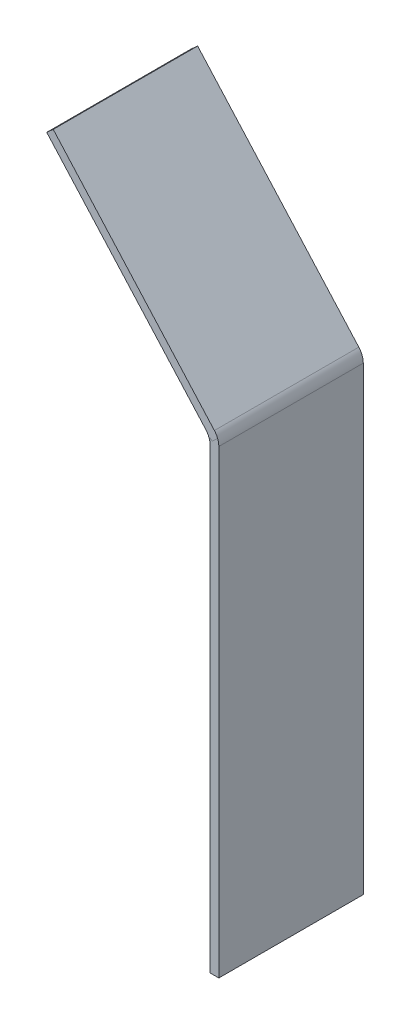
ISO-10303-21;
HEADER;
FILE_DESCRIPTION(('STEP AP214'),'2;1');
FILE_NAME('part.step','',(''),(''),'','','');
FILE_SCHEMA(('AUTOMOTIVE_DESIGN { 1 0 10303 214 1 1 1 1 }'));
ENDSEC;
DATA;
#1=APPLICATION_CONTEXT('core data for automotive mechanical design processes');
#2=APPLICATION_PROTOCOL_DEFINITION('international standard','automotive_design',2000,#1);
#3=PRODUCT_CONTEXT('',#1,'mechanical');
#4=PRODUCT('Part','Part','',(#3));
#5=PRODUCT_RELATED_PRODUCT_CATEGORY('part','',(#4));
#6=PRODUCT_DEFINITION_FORMATION('','',#4);
#7=PRODUCT_DEFINITION_CONTEXT('part definition',#1,'design');
#8=PRODUCT_DEFINITION('design','',#6,#7);
#9=PRODUCT_DEFINITION_SHAPE('','',#8);
#10=(LENGTH_UNIT() NAMED_UNIT(*) SI_UNIT(.MILLI.,.METRE.));
#11=(NAMED_UNIT(*) PLANE_ANGLE_UNIT() SI_UNIT($,.RADIAN.));
#12=(NAMED_UNIT(*) SI_UNIT($,.STERADIAN.) SOLID_ANGLE_UNIT());
#13=UNCERTAINTY_MEASURE_WITH_UNIT(LENGTH_MEASURE(1.E-05),#10,'distance_accuracy_value','');
#14=(GEOMETRIC_REPRESENTATION_CONTEXT(3) GLOBAL_UNCERTAINTY_ASSIGNED_CONTEXT((#13)) GLOBAL_UNIT_ASSIGNED_CONTEXT((#10,
#11,#12)) REPRESENTATION_CONTEXT('',''));
#15=CARTESIAN_POINT('',(0.,0.,0.));
#16=DIRECTION('',(0.,0.,1.));
#17=DIRECTION('',(1.,0.,0.));
#18=AXIS2_PLACEMENT_3D('',#15,#16,#17);
#19=CARTESIAN_POINT('',(-2.5,62.6737873182417,0.00137776001932606));
#20=DIRECTION('',(0.,2.19830343425287E-05,-0.999999999758373));
#21=DIRECTION('',(0.,0.999999999758373,2.19830343425287E-05));
#22=AXIS2_PLACEMENT_3D('',#19,#20,#21);
#23=CYLINDRICAL_SURFACE('',#22,2.);
#24=DIRECTION('',(0.,-2.19830343425287E-05,0.999999999758373));
#25=VECTOR('',#24,1.);
#26=CARTESIAN_POINT('',(-1.00928801516023,64.0071206514319,0.0014070707317867));
#27=LINE('',#26,#25);
#28=CARTESIAN_POINT('',(-1.00928801516023,64.0073038017603,-8.33003278047712));
#29=VERTEX_POINT('',#28);
#30=CARTESIAN_POINT('',(-1.00928801516023,64.0069396769131,8.23387015339831));
#31=VERTEX_POINT('',#30);
#32=EDGE_CURVE('E133',#29,#31,#27,.T.);
#33=ORIENTED_EDGE('',*,*,#32,.F.);
#34=CARTESIAN_POINT('',(-2.5,62.6739704685701,-8.33006209118958));
#35=DIRECTION('',(1.09234575886277E-05,9.77023748700299E-06,-0.99999999989261));
#36=DIRECTION('',(-0.666666666675069,0.745355992492415,0.));
#37=AXIS2_PLACEMENT_3D('',#34,#35,#36);
#38=ELLIPSE('',#37,2.00000000026847,2.);
#39=CARTESIAN_POINT('',(-0.5,62.6739704680899,-8.3300402442744));
#40=VERTEX_POINT('',#39);
#41=EDGE_CURVE('E46',#29,#40,#38,.T.);
#42=ORIENTED_EDGE('',*,*,#41,.T.);
#43=DIRECTION('',(0.,-2.19830343425287E-05,0.999999999758373));
#44=VECTOR('',#43,1.);
#45=CARTESIAN_POINT('',(-0.5,62.6737873182417,0.00137776001932606));
#46=LINE('',#45,#44);
#47=CARTESIAN_POINT('',(-0.5,62.673606343203,8.23386594537373));
#48=VERTEX_POINT('',#47);
#49=EDGE_CURVE('E277',#48,#40,#46,.F.);
#50=ORIENTED_EDGE('',*,*,#49,.F.);
#51=CARTESIAN_POINT('',(-2.5,62.673606343723,8.23384084268585));
#52=DIRECTION('',(-1.09234575886277E-05,-9.77023748700298E-06,0.99999999989261));
#53=DIRECTION('',(-0.666666666675069,0.745355992492414,0.));
#54=AXIS2_PLACEMENT_3D('',#51,#52,#53);
#55=ELLIPSE('',#54,2.00000000026847,2.);
#56=EDGE_CURVE('E11',#48,#31,#55,.T.);
#57=ORIENTED_EDGE('',*,*,#56,.T.);
#58=EDGE_LOOP('',(#33,#42,#50,#57));
#59=FACE_BOUND('',#58,.T.);
#60=ADVANCED_FACE('F39',(#59),#23,.F.);
#61=CARTESIAN_POINT('',(-1.5,63.0557533294683,0.00138615679127075));
#62=DIRECTION('',(0.,2.19830343425287E-05,-0.999999999758373));
#63=DIRECTION('',(0.,0.999999999758373,2.19830343425287E-05));
#64=AXIS2_PLACEMENT_3D('',#61,#62,#63);
#65=CYLINDRICAL_SURFACE('',#64,2.);
#66=DIRECTION('',(0.,2.19830343425287E-05,-0.999999999758373));
#67=VECTOR('',#66,1.);
#68=CARTESIAN_POINT('',(-0.00928801516023731,64.3890866626585,0.00141546750373138));
#69=LINE('',#68,#67);
#70=CARTESIAN_POINT('',(-0.00928801516024565,64.3889056880022,8.23388480875454));
#71=VERTEX_POINT('',#70);
#72=CARTESIAN_POINT('',(-0.00928801516022993,64.3892698128493,-8.33001812512089));
#73=VERTEX_POINT('',#72);
#74=EDGE_CURVE('E197',#71,#73,#69,.T.);
#75=ORIENTED_EDGE('',*,*,#74,.F.);
#76=CARTESIAN_POINT('',(-1.5,63.055572354812,8.23385549804208));
#77=DIRECTION('',(-1.09234575886277E-05,-9.77023748700298E-06,0.99999999989261));
#78=DIRECTION('',(-0.666666666675069,0.745355992492414,0.));
#79=AXIS2_PLACEMENT_3D('',#76,#77,#78);
#80=ELLIPSE('',#79,2.00000000026847,2.);
#81=CARTESIAN_POINT('',(0.364249124789158,63.7798479930207,8.23388293843332));
#82=VERTEX_POINT('',#81);
#83=EDGE_CURVE('E233',#82,#71,#80,.T.);
#84=ORIENTED_EDGE('',*,*,#83,.F.);
#85=CARTESIAN_POINT('',(0.364249124896864,63.779847993117,8.23386594537373));
#86=CARTESIAN_POINT('',(0.364244899312326,63.7798442136393,8.9005326120163));
#87=CARTESIAN_POINT('',(0.364240673727787,63.7798404341616,9.56719927865886));
#88=CARTESIAN_POINT('',(0.36423222255871,63.7798328752062,10.900532611944));
#89=CARTESIAN_POINT('',(0.364227996974171,63.7798290957285,11.5671992785865));
#90=CARTESIAN_POINT('',(0.364223771389633,63.7798253162507,12.2338659452291));
#91=B_SPLINE_CURVE_WITH_KNOTS('',3,(#85,#86,#87,#88,#89,#90),.UNSPECIFIED.,.F.,.F.,(4,2,4),(0.,
2.,4.),.UNSPECIFIED.);
#92=CARTESIAN_POINT('',(0.364249124896867,63.779847993117,8.23386594537373));
#93=VERTEX_POINT('',#92);
#94=EDGE_CURVE('E224',#93,#82,#91,.T.);
#95=ORIENTED_EDGE('',*,*,#94,.F.);
#96=CARTESIAN_POINT('',(-1.5,63.0555723545824,8.23386594537373));
#97=DIRECTION('',(0.,0.,1.));
#98=DIRECTION('',(0.,1.,0.));
#99=AXIS2_PLACEMENT_3D('',#96,#97,#98);
#100=ELLIPSE('',#99,2.00000000048325,2.);
#101=CARTESIAN_POINT('',(0.5,63.0555723545824,8.23386594537373));
#102=VERTEX_POINT('',#101);
#103=EDGE_CURVE('E234',#102,#93,#100,.T.);
#104=ORIENTED_EDGE('',*,*,#103,.F.);
#105=DIRECTION('',(0.,2.19830343425287E-05,-0.999999999758373));
#106=VECTOR('',#105,1.);
#107=CARTESIAN_POINT('',(0.5,63.0557533294683,0.00138615679127065));
#108=LINE('',#107,#106);
#109=CARTESIAN_POINT('',(0.5,63.0559365637002,-8.33387043234571));
#110=VERTEX_POINT('',#109);
#111=EDGE_CURVE('E290',#110,#102,#108,.F.);
#112=ORIENTED_EDGE('',*,*,#111,.F.);
#113=CARTESIAN_POINT('',(-1.5,63.0559365637002,-8.33387043234571));
#114=DIRECTION('',(0.,0.,-1.));
#115=DIRECTION('',(0.,1.,0.));
#116=AXIS2_PLACEMENT_3D('',#113,#114,#115);
#117=ELLIPSE('',#116,2.00000000048325,2.);
#118=CARTESIAN_POINT('',(0.33050940155654,63.8616879714724,-8.33387043234571));
#119=VERTEX_POINT('',#118);
#120=EDGE_CURVE('E211',#119,#110,#117,.T.);
#121=ORIENTED_EDGE('',*,*,#120,.F.);
#122=CARTESIAN_POINT('',(0.330509364293782,63.8616879714724,-8.33001956795851));
#123=CARTESIAN_POINT('',(0.330515814851322,63.8616879714724,-8.99668623459397));
#124=CARTESIAN_POINT('',(0.330522265408862,63.8616879714724,-9.66335290122943));
#125=CARTESIAN_POINT('',(0.330535166523942,63.8616879714724,-10.9966862345003));
#126=CARTESIAN_POINT('',(0.330541617081482,63.8616879714724,-11.6633529011358));
#127=CARTESIAN_POINT('',(0.330548067639022,63.8616879714724,-12.3300195677713));
#128=B_SPLINE_CURVE_WITH_KNOTS('',3,(#122,#123,#124,#125,#126,#127),.UNSPECIFIED.,.F.,.F.,(4,2,
4),(0.,2.,4.),.UNSPECIFIED.);
#129=CARTESIAN_POINT('',(0.330509364293782,63.8616879714724,-8.33001956795851));
#130=VERTEX_POINT('',#129);
#131=EDGE_CURVE('E203',#130,#119,#128,.T.);
#132=ORIENTED_EDGE('',*,*,#131,.F.);
#133=CARTESIAN_POINT('',(-1.5,63.0559364796592,-8.33004743583335));
#134=DIRECTION('',(1.09234575886277E-05,9.77023748700299E-06,-0.99999999989261));
#135=DIRECTION('',(-0.666666666675069,0.745355992492415,0.));
#136=AXIS2_PLACEMENT_3D('',#133,#134,#135);
#137=ELLIPSE('',#136,2.00000000026847,2.);
#138=EDGE_CURVE('E200',#73,#130,#137,.T.);
#139=ORIENTED_EDGE('',*,*,#138,.F.);
#140=EDGE_LOOP('',(#75,#84,#95,#104,#112,#121,#132,#139));
#141=FACE_BOUND('',#140,.T.);
#142=ADVANCED_FACE('F217',(#141),#65,.T.);
#143=CARTESIAN_POINT('',(-0.5,63.8616879714724,-8.33387043234571));
#144=DIRECTION('',(0.,0.,-1.));
#145=DIRECTION('',(0.,1.,0.));
#146=AXIS2_PLACEMENT_3D('',#143,#144,#145);
#147=PLANE('',#146);
#148=DIRECTION('',(1.,0.,0.));
#149=VECTOR('',#148,1.);
#150=CARTESIAN_POINT('',(-0.5,63.8616879714724,-8.33387043234571));
#151=LINE('',#150,#149);
#152=CARTESIAN_POINT('',(-0.5,63.8616879714724,-8.33387043234571));
#153=VERTEX_POINT('',#152);
#154=EDGE_CURVE('E188',#153,#119,#151,.T.);
#155=ORIENTED_EDGE('',*,*,#154,.T.);
#156=ORIENTED_EDGE('',*,*,#120,.T.);
#157=DIRECTION('',(0.,1.,0.));
#158=VECTOR('',#157,1.);
#159=CARTESIAN_POINT('',(0.5,63.8616879714724,-8.33387043234571));
#160=LINE('',#159,#158);
#161=CARTESIAN_POINT('',(0.5,10.2578723298936,-8.33387043234571));
#162=VERTEX_POINT('',#161);
#163=EDGE_CURVE('E167',#162,#110,#160,.T.);
#164=ORIENTED_EDGE('',*,*,#163,.F.);
#165=DIRECTION('',(1.,0.,0.));
#166=VECTOR('',#165,1.);
#167=CARTESIAN_POINT('',(-0.5,10.2578723298936,-8.33387043234571));
#168=LINE('',#167,#166);
#169=CARTESIAN_POINT('',(-0.5,10.2578723298936,-8.33387043234571));
#170=VERTEX_POINT('',#169);
#171=EDGE_CURVE('E189',#170,#162,#168,.T.);
#172=ORIENTED_EDGE('',*,*,#171,.F.);
#173=DIRECTION('',(0.,1.,0.));
#174=VECTOR('',#173,1.);
#175=CARTESIAN_POINT('',(-0.5,63.8616879714724,-8.33387043234571));
#176=LINE('',#175,#174);
#177=EDGE_CURVE('E175',#170,#153,#176,.T.);
#178=ORIENTED_EDGE('',*,*,#177,.T.);
#179=EDGE_LOOP('',(#155,#156,#164,#172,#178));
#180=FACE_BOUND('',#179,.T.);
#181=ADVANCED_FACE('F220',(#180),#147,.T.);
#182=CARTESIAN_POINT('',(-0.5,10.2578723298936,-8.33387043234571));
#183=DIRECTION('',(0.,-1.,0.));
#184=DIRECTION('',(0.,0.,-1.));
#185=AXIS2_PLACEMENT_3D('',#182,#183,#184);
#186=PLANE('',#185);
#187=ORIENTED_EDGE('',*,*,#171,.T.);
#188=DIRECTION('',(0.,0.,-1.));
#189=VECTOR('',#188,1.);
#190=CARTESIAN_POINT('',(0.5,10.2578723298936,-8.33387043234571));
#191=LINE('',#190,#189);
#192=CARTESIAN_POINT('',(0.5,10.2578723298936,8.23386594537373));
#193=VERTEX_POINT('',#192);
#194=EDGE_CURVE('E172',#193,#162,#191,.T.);
#195=ORIENTED_EDGE('',*,*,#194,.F.);
#196=DIRECTION('',(1.,0.,0.));
#197=VECTOR('',#196,1.);
#198=CARTESIAN_POINT('',(-0.5,10.2578723298936,8.23386594537373));
#199=LINE('',#198,#197);
#200=CARTESIAN_POINT('',(-0.5,10.2578723298936,8.23386594537373));
#201=VERTEX_POINT('',#200);
#202=EDGE_CURVE('E191',#201,#193,#199,.T.);
#203=ORIENTED_EDGE('',*,*,#202,.F.);
#204=DIRECTION('',(0.,0.,-1.));
#205=VECTOR('',#204,1.);
#206=CARTESIAN_POINT('',(-0.5,10.2578723298936,-8.33387043234571));
#207=LINE('',#206,#205);
#208=EDGE_CURVE('E185',#201,#170,#207,.T.);
#209=ORIENTED_EDGE('',*,*,#208,.T.);
#210=EDGE_LOOP('',(#187,#195,#203,#209));
#211=FACE_BOUND('',#210,.T.);
#212=ADVANCED_FACE('F259',(#211),#186,.T.);
#213=CARTESIAN_POINT('',(-0.5,63.8616879714724,8.23386594537373));
#214=DIRECTION('',(0.,0.,1.));
#215=DIRECTION('',(0.,-1.,0.));
#216=AXIS2_PLACEMENT_3D('',#213,#214,#215);
#217=PLANE('',#216);
#218=DIRECTION('',(0.,-1.,0.));
#219=VECTOR('',#218,1.);
#220=CARTESIAN_POINT('',(0.5,63.8616879714724,8.23386594537373));
#221=LINE('',#220,#219);
#222=EDGE_CURVE('E170',#102,#193,#221,.T.);
#223=ORIENTED_EDGE('',*,*,#222,.F.);
#224=ORIENTED_EDGE('',*,*,#103,.T.);
#225=DIRECTION('',(0.745355992499929,0.666666666666667,0.));
#226=VECTOR('',#225,1.);
#227=CARTESIAN_POINT('',(-0.0752226656281101,63.386772473994,8.23386594537373));
#228=LINE('',#227,#226);
#229=CARTESIAN_POINT('',(-0.285984299031434,63.1982615381846,8.23386594537373));
#230=VERTEX_POINT('',#229);
#231=EDGE_CURVE('E164',#230,#93,#228,.T.);
#232=ORIENTED_EDGE('',*,*,#231,.F.);
#233=DIRECTION('',(-0.666666666666667,0.74535599249993,0.));
#234=VECTOR('',#233,1.);
#235=CARTESIAN_POINT('',(-0.285984299114181,63.1982615381846,8.23387015339831));
#236=LINE('',#235,#234);
#237=CARTESIAN_POINT('',(-0.500000000000005,63.437538365901,8.23387015339831));
#238=VERTEX_POINT('',#237);
#239=EDGE_CURVE('E134',#230,#238,#236,.T.);
#240=ORIENTED_EDGE('',*,*,#239,.T.);
#241=DIRECTION('',(0.,-1.,0.));
#242=VECTOR('',#241,1.);
#243=CARTESIAN_POINT('',(-0.5,63.8616879714724,8.23386594537373));
#244=LINE('',#243,#242);
#245=EDGE_CURVE('E182',#238,#48,#244,.T.);
#246=ORIENTED_EDGE('',*,*,#245,.T.);
#247=EDGE_CURVE('E181',#48,#201,#244,.T.);
#248=ORIENTED_EDGE('',*,*,#247,.T.);
#249=ORIENTED_EDGE('',*,*,#202,.T.);
#250=EDGE_LOOP('',(#223,#224,#232,#240,#246,#248,#249));
#251=FACE_BOUND('',#250,.T.);
#252=ADVANCED_FACE('F261',(#251),#217,.T.);
#253=CARTESIAN_POINT('',(-0.5,63.8616879714724,-8.33387043234571));
#254=DIRECTION('',(0.,1.,0.));
#255=DIRECTION('',(0.,0.,1.));
#256=AXIS2_PLACEMENT_3D('',#253,#254,#255);
#257=PLANE('',#256);
#258=DIRECTION('',(-0.999999999940339,0.,-1.0923457589149E-05));
#259=VECTOR('',#258,1.);
#260=CARTESIAN_POINT('',(-0.500000041965656,63.8616879714724,-8.33002863999279));
#261=LINE('',#260,#259);
#262=CARTESIAN_POINT('',(-0.5,63.8616879714724,-8.33003188011866));
#263=VERTEX_POINT('',#262);
#264=EDGE_CURVE('E161',#130,#263,#261,.T.);
#265=ORIENTED_EDGE('',*,*,#264,.F.);
#266=ORIENTED_EDGE('',*,*,#131,.T.);
#267=ORIENTED_EDGE('',*,*,#154,.F.);
#268=DIRECTION('',(0.,0.,1.));
#269=VECTOR('',#268,1.);
#270=CARTESIAN_POINT('',(-0.5,63.8616879714724,-8.33387043234571));
#271=LINE('',#270,#269);
#272=EDGE_CURVE('E178',#153,#263,#271,.T.);
#273=ORIENTED_EDGE('',*,*,#272,.T.);
#274=EDGE_LOOP('',(#265,#266,#267,#273));
#275=FACE_BOUND('',#274,.T.);
#276=ADVANCED_FACE('F213',(#275),#257,.T.);
#277=CARTESIAN_POINT('',(-0.5,0.,0.));
#278=DIRECTION('',(-1.,0.,0.));
#279=DIRECTION('',(0.,0.,1.));
#280=AXIS2_PLACEMENT_3D('',#277,#278,#279);
#281=PLANE('',#280);
#282=ORIENTED_EDGE('',*,*,#247,.F.);
#283=ORIENTED_EDGE('',*,*,#49,.T.);
#284=DIRECTION('',(0.,-0.999999999952271,-9.77023748758589E-06));
#285=VECTOR('',#284,1.);
#286=CARTESIAN_POINT('',(-0.5,8.13924541669027E-05,-8.33065258305497));
#287=LINE('',#286,#285);
#288=EDGE_CURVE('E53',#263,#40,#287,.T.);
#289=ORIENTED_EDGE('',*,*,#288,.F.);
#290=ORIENTED_EDGE('',*,*,#272,.F.);
#291=ORIENTED_EDGE('',*,*,#177,.F.);
#292=ORIENTED_EDGE('',*,*,#208,.F.);
#293=EDGE_LOOP('',(#282,#283,#289,#290,#291,#292));
#294=FACE_BOUND('',#293,.T.);
#295=ADVANCED_FACE('F254',(#294),#281,.T.);
#296=CARTESIAN_POINT('',(0.5,0.,0.));
#297=DIRECTION('',(-1.,0.,0.));
#298=DIRECTION('',(0.,0.,1.));
#299=AXIS2_PLACEMENT_3D('',#296,#297,#298);
#300=PLANE('',#299);
#301=ORIENTED_EDGE('',*,*,#163,.T.);
#302=ORIENTED_EDGE('',*,*,#111,.T.);
#303=ORIENTED_EDGE('',*,*,#222,.T.);
#304=ORIENTED_EDGE('',*,*,#194,.T.);
#305=EDGE_LOOP('',(#301,#302,#303,#304));
#306=FACE_BOUND('',#305,.T.);
#307=ADVANCED_FACE('F251',(#306),#300,.F.);
#308=CARTESIAN_POINT('',(0.459371693305705,63.8649282047796,8.23388480875454));
#309=DIRECTION('',(-1.09234575886277E-05,-9.77023748700298E-06,0.99999999989261));
#310=DIRECTION('',(0.999999999940339,0.,1.0923457589149E-05));
#311=AXIS2_PLACEMENT_3D('',#308,#309,#310);
#312=PLANE('',#311);
#313=DIRECTION('',(-0.745355992419886,-0.666666666595074,-1.46553562305045E-05));
#314=VECTOR('',#313,1.);
#315=CARTESIAN_POINT('',(0.459371693305705,63.8649282047796,8.23388480875454));
#316=LINE('',#315,#314);
#317=EDGE_CURVE('E159',#82,#230,#316,.T.);
#318=ORIENTED_EDGE('',*,*,#317,.F.);
#319=ORIENTED_EDGE('',*,*,#83,.T.);
#320=DIRECTION('',(-0.666666666666667,0.74535599249993,0.));
#321=VECTOR('',#320,1.);
#322=CARTESIAN_POINT('',(0.459371693305705,63.8649282047796,8.23388480875454));
#323=LINE('',#322,#321);
#324=CARTESIAN_POINT('',(-18.4973095507562,85.0591421495385,8.23388480875454));
#325=VERTEX_POINT('',#324);
#326=EDGE_CURVE('E141',#71,#325,#323,.T.);
#327=ORIENTED_EDGE('',*,*,#326,.T.);
#328=DIRECTION('',(-0.745355992419886,-0.666666666595074,-1.46553562305045E-05));
#329=VECTOR('',#328,1.);
#330=CARTESIAN_POINT('',(-18.4973095507562,85.0591421495385,8.23388480875454));
#331=LINE('',#330,#329);
#332=CARTESIAN_POINT('',(-19.2426655431761,84.3924754829434,8.23387015339831));
#333=VERTEX_POINT('',#332);
#334=EDGE_CURVE('E137',#325,#333,#331,.T.);
#335=ORIENTED_EDGE('',*,*,#334,.T.);
#336=EDGE_CURVE('E125',#31,#333,#236,.T.);
#337=ORIENTED_EDGE('',*,*,#336,.F.);
#338=ORIENTED_EDGE('',*,*,#56,.F.);
#339=ORIENTED_EDGE('',*,*,#245,.F.);
#340=ORIENTED_EDGE('',*,*,#239,.F.);
#341=EDGE_LOOP('',(#318,#319,#327,#335,#337,#338,#339,#340));
#342=FACE_BOUND('',#341,.T.);
#343=ADVANCED_FACE('F139',(#342),#312,.T.);
#344=CARTESIAN_POINT('',(0.459371693305705,63.8649282047796,8.23388480875454));
#345=DIRECTION('',(0.666666666666667,-0.74535599249993,0.));
#346=DIRECTION('',(0.745355992499929,0.666666666666667,0.));
#347=AXIS2_PLACEMENT_3D('',#344,#345,#346);
#348=PLANE('',#347);
#349=ORIENTED_EDGE('',*,*,#231,.T.);
#350=ORIENTED_EDGE('',*,*,#94,.T.);
#351=ORIENTED_EDGE('',*,*,#317,.T.);
#352=EDGE_LOOP('',(#349,#350,#351));
#353=FACE_BOUND('',#352,.T.);
#354=ADVANCED_FACE('F236',(#353),#348,.T.);
#355=CARTESIAN_POINT('',(0.459552628396927,63.865090038045,-8.33001812512089));
#356=DIRECTION('',(1.09234575886277E-05,9.77023748700299E-06,-0.99999999989261));
#357=DIRECTION('',(-0.999999999940339,0.,-1.0923457589149E-05));
#358=AXIS2_PLACEMENT_3D('',#355,#356,#357);
#359=PLANE('',#358);
#360=DIRECTION('',(0.666666666666667,-0.745355992499929,0.));
#361=VECTOR('',#360,1.);
#362=CARTESIAN_POINT('',(0.459552628396927,63.865090038045,-8.33001812512089));
#363=LINE('',#362,#361);
#364=CARTESIAN_POINT('',(-18.497128615665,85.0593039828038,-8.33001812512089));
#365=VERTEX_POINT('',#364);
#366=EDGE_CURVE('E146',#365,#73,#363,.T.);
#367=ORIENTED_EDGE('',*,*,#366,.T.);
#368=ORIENTED_EDGE('',*,*,#138,.T.);
#369=ORIENTED_EDGE('',*,*,#264,.T.);
#370=ORIENTED_EDGE('',*,*,#288,.T.);
#371=ORIENTED_EDGE('',*,*,#41,.F.);
#372=DIRECTION('',(0.666666666666667,-0.745355992499929,0.));
#373=VECTOR('',#372,1.);
#374=CARTESIAN_POINT('',(-0.285803364022959,63.19842337145,-8.33003278047712));
#375=LINE('',#374,#373);
#376=CARTESIAN_POINT('',(-19.2424846080849,84.3926373162088,-8.33003278047712));
#377=VERTEX_POINT('',#376);
#378=EDGE_CURVE('E149',#377,#29,#375,.T.);
#379=ORIENTED_EDGE('',*,*,#378,.F.);
#380=DIRECTION('',(-0.745355992419886,-0.666666666595074,-1.46553562305045E-05));
#381=VECTOR('',#380,1.);
#382=CARTESIAN_POINT('',(-18.497128615665,85.0593039828038,-8.33001812512089));
#383=LINE('',#382,#381);
#384=EDGE_CURVE('E145',#365,#377,#383,.T.);
#385=ORIENTED_EDGE('',*,*,#384,.F.);
#386=EDGE_LOOP('',(#367,#368,#369,#370,#371,#379,#385));
#387=FACE_BOUND('',#386,.T.);
#388=ADVANCED_FACE('F241',(#387),#359,.T.);
#389=CARTESIAN_POINT('',(-18.4973095507562,85.0591421495385,8.23388480875454));
#390=DIRECTION('',(-0.666666666666667,0.74535599249993,0.));
#391=DIRECTION('',(-0.745355992499929,-0.666666666666667,0.));
#392=AXIS2_PLACEMENT_3D('',#389,#390,#391);
#393=PLANE('',#392);
#394=ORIENTED_EDGE('',*,*,#384,.T.);
#395=DIRECTION('',(1.09234575887707E-05,9.77023748656597E-06,-0.99999999989261));
#396=VECTOR('',#395,1.);
#397=CARTESIAN_POINT('',(-19.2426655431761,84.3924754829434,8.23387015339831));
#398=LINE('',#397,#396);
#399=EDGE_CURVE('E130',#333,#377,#398,.T.);
#400=ORIENTED_EDGE('',*,*,#399,.F.);
#401=ORIENTED_EDGE('',*,*,#334,.F.);
#402=DIRECTION('',(1.09234575887707E-05,9.77023748656597E-06,-0.99999999989261));
#403=VECTOR('',#402,1.);
#404=CARTESIAN_POINT('',(-18.4973095507562,85.0591421495385,8.23388480875454));
#405=LINE('',#404,#403);
#406=EDGE_CURVE('E155',#325,#365,#405,.T.);
#407=ORIENTED_EDGE('',*,*,#406,.T.);
#408=EDGE_LOOP('',(#394,#400,#401,#407));
#409=FACE_BOUND('',#408,.T.);
#410=ADVANCED_FACE('F148',(#409),#393,.T.);
#411=CARTESIAN_POINT('',(31.9900343972418,28.6127566059157,0.000628995211254335));
#412=DIRECTION('',(-0.745355992419886,-0.666666666595074,-1.46553562303198E-05));
#413=DIRECTION('',(0.666666666666667,-0.74535599249993,0.));
#414=AXIS2_PLACEMENT_3D('',#411,#412,#413);
#415=PLANE('',#414);
#416=ORIENTED_EDGE('',*,*,#326,.F.);
#417=ORIENTED_EDGE('',*,*,#74,.T.);
#418=ORIENTED_EDGE('',*,*,#366,.F.);
#419=ORIENTED_EDGE('',*,*,#406,.F.);
#420=EDGE_LOOP('',(#416,#417,#418,#419));
#421=FACE_BOUND('',#420,.T.);
#422=ADVANCED_FACE('F243',(#421),#415,.F.);
#423=CARTESIAN_POINT('',(31.244678404822,27.9460899393207,0.00061433985502383));
#424=DIRECTION('',(-0.745355992419886,-0.666666666595074,-1.46553562303198E-05));
#425=DIRECTION('',(0.666666666666667,-0.74535599249993,0.));
#426=AXIS2_PLACEMENT_3D('',#423,#424,#425);
#427=PLANE('',#426);
#428=ORIENTED_EDGE('',*,*,#378,.T.);
#429=ORIENTED_EDGE('',*,*,#32,.T.);
#430=ORIENTED_EDGE('',*,*,#336,.T.);
#431=ORIENTED_EDGE('',*,*,#399,.T.);
#432=EDGE_LOOP('',(#428,#429,#430,#431));
#433=FACE_BOUND('',#432,.T.);
#434=ADVANCED_FACE('F128',(#433),#427,.T.);
#435=CLOSED_SHELL('',(#60,#142,#181,#212,#252,#276,#295,#307,#343,#354,#388,#410,#422,#434));
#436=MANIFOLD_SOLID_BREP('B2',#435);
#437=ADVANCED_BREP_SHAPE_REPRESENTATION('',(#18,#436),#14);
#438=SHAPE_DEFINITION_REPRESENTATION(#9,#437);
ENDSEC;
END-ISO-10303-21;
